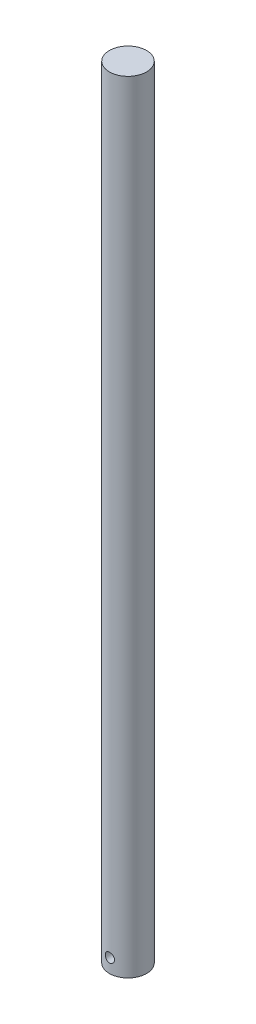
ISO-10303-21;
HEADER;
FILE_DESCRIPTION(('STEP AP214'),'2;1');
FILE_NAME('part.step','',(''),(''),'','','');
FILE_SCHEMA(('AUTOMOTIVE_DESIGN { 1 0 10303 214 1 1 1 1 }'));
ENDSEC;
DATA;
#1=APPLICATION_CONTEXT('core data for automotive mechanical design processes');
#2=APPLICATION_PROTOCOL_DEFINITION('international standard','automotive_design',2000,#1);
#3=PRODUCT_CONTEXT('',#1,'mechanical');
#4=PRODUCT('Part','Part','',(#3));
#5=PRODUCT_RELATED_PRODUCT_CATEGORY('part','',(#4));
#6=PRODUCT_DEFINITION_FORMATION('','',#4);
#7=PRODUCT_DEFINITION_CONTEXT('part definition',#1,'design');
#8=PRODUCT_DEFINITION('design','',#6,#7);
#9=PRODUCT_DEFINITION_SHAPE('','',#8);
#10=(LENGTH_UNIT() NAMED_UNIT(*) SI_UNIT(.MILLI.,.METRE.));
#11=(NAMED_UNIT(*) PLANE_ANGLE_UNIT() SI_UNIT($,.RADIAN.));
#12=(NAMED_UNIT(*) SI_UNIT($,.STERADIAN.) SOLID_ANGLE_UNIT());
#13=UNCERTAINTY_MEASURE_WITH_UNIT(LENGTH_MEASURE(1.E-05),#10,'distance_accuracy_value','');
#14=(GEOMETRIC_REPRESENTATION_CONTEXT(3) GLOBAL_UNCERTAINTY_ASSIGNED_CONTEXT((#13)) GLOBAL_UNIT_ASSIGNED_CONTEXT((#10,
#11,#12)) REPRESENTATION_CONTEXT('',''));
#15=CARTESIAN_POINT('',(0.,0.,0.));
#16=DIRECTION('',(0.,0.,1.));
#17=DIRECTION('',(1.,0.,0.));
#18=AXIS2_PLACEMENT_3D('',#15,#16,#17);
#19=CARTESIAN_POINT('',(0.,420.,0.));
#20=DIRECTION('',(0.,-1.,0.));
#21=DIRECTION('',(0.,0.,-1.));
#22=AXIS2_PLACEMENT_3D('',#19,#20,#21);
#23=CYLINDRICAL_SURFACE('',#22,10.);
#24=CARTESIAN_POINT('',(0.,9.95000000000001,-10.));
#25=CARTESIAN_POINT('',(-0.138126814449551,9.94999612376975,-9.99999766446687));
#26=CARTESIAN_POINT('',(-0.276296929717937,9.93851408204369,-9.99710963553044));
#27=CARTESIAN_POINT('',(-0.54867720628422,9.89295808115499,-9.98586856383157));
#28=CARTESIAN_POINT('',(-0.682885078117899,9.85887131743691,-9.97751242366627));
#29=CARTESIAN_POINT('',(-0.943368120304295,9.76926791089652,-9.9562604388672));
#30=CARTESIAN_POINT('',(-1.06965260571667,9.71377700214122,-9.94337004736764));
#31=CARTESIAN_POINT('',(-1.31112021984071,9.58303101659193,-9.91442239679369));
#32=CARTESIAN_POINT('',(-1.42630297391461,9.50777527313505,-9.89836503090261));
#33=CARTESIAN_POINT('',(-1.64466987883486,9.3379986839097,-9.86445689319489));
#34=CARTESIAN_POINT('',(-1.74759281676843,9.24314737506823,-9.84657845246877));
#35=CARTESIAN_POINT('',(-1.93624821200553,9.03757965848494,-9.8112270019656));
#36=CARTESIAN_POINT('',(-2.02197872824865,8.9268614617551,-9.79375403816446));
#37=CARTESIAN_POINT('',(-2.17504423799829,8.69067462210501,-9.76091292830281));
#38=CARTESIAN_POINT('',(-2.2420870265419,8.56501128198545,-9.74557990774685));
#39=CARTESIAN_POINT('',(-2.35399484758457,8.30375264723327,-9.71915824696694));
#40=CARTESIAN_POINT('',(-2.39886342573357,8.16815894444664,-9.70806892824031));
#41=CARTESIAN_POINT('',(-2.46425806134127,7.89376083633056,-9.69167461160538));
#42=CARTESIAN_POINT('',(-2.48525378055342,7.75507517327001,-9.68625818328352));
#43=CARTESIAN_POINT('',(-2.50376962511068,7.47605238500109,-9.68148937432652));
#44=CARTESIAN_POINT('',(-2.50129356969685,7.33571553217977,-9.68213600713214));
#45=CARTESIAN_POINT('',(-2.47331087439951,7.06097365375774,-9.68932009194695));
#46=CARTESIAN_POINT('',(-2.44836390031772,6.92650729755778,-9.69571438345489));
#47=CARTESIAN_POINT('',(-2.37704031150499,6.6637315818149,-9.71344516118448));
#48=CARTESIAN_POINT('',(-2.33066217011565,6.53542266161846,-9.72478199948731));
#49=CARTESIAN_POINT('',(-2.21731579656197,6.28710330624645,-9.75125189842765));
#50=CARTESIAN_POINT('',(-2.1501444453882,6.16718971368405,-9.76642212449693));
#51=CARTESIAN_POINT('',(-1.99726046002491,5.94013548373863,-9.79882851409985));
#52=CARTESIAN_POINT('',(-1.91154458134806,5.83299708655458,-9.81606503891047));
#53=CARTESIAN_POINT('',(-1.72110570780203,5.63132730717599,-9.85126467566486));
#54=CARTESIAN_POINT('',(-1.61591043027643,5.53724251656441,-9.86923449130002));
#55=CARTESIAN_POINT('',(-1.39101986250617,5.36796459589349,-9.90343275964594));
#56=CARTESIAN_POINT('',(-1.27132412951324,5.29277204289405,-9.91966115915679));
#57=CARTESIAN_POINT('',(-1.02019314780232,5.16324902295935,-9.94862886823651));
#58=CARTESIAN_POINT('',(-0.888718988681039,5.10899109957595,-9.96135600212879));
#59=CARTESIAN_POINT('',(-0.618126680238138,5.02347115715071,-9.98179861652361));
#60=CARTESIAN_POINT('',(-0.479009998584141,4.9922047393031,-9.98951505565468));
#61=CARTESIAN_POINT('',(-0.200899950650045,4.95423739073527,-9.99892498785624));
#62=CARTESIAN_POINT('',(-0.0619945333136842,4.94692828987449,-10.0007675584713));
#63=CARTESIAN_POINT('',(0.215054791335847,4.95541500342581,-9.99864674690754));
#64=CARTESIAN_POINT('',(0.353198766074327,4.97120873799856,-9.99468388736421));
#65=CARTESIAN_POINT('',(0.622690447960818,5.02495151398562,-9.98149301878918));
#66=CARTESIAN_POINT('',(0.754108531614584,5.06256877246162,-9.97234390309647));
#67=CARTESIAN_POINT('',(1.00876215408753,5.1585118067141,-9.94981177723595));
#68=CARTESIAN_POINT('',(1.13199686505442,5.21683967385537,-9.93642833949965));
#69=CARTESIAN_POINT('',(1.36920522404972,5.35372688145779,-9.9065551321037));
#70=CARTESIAN_POINT('',(1.48297573639294,5.43262685399427,-9.89001445610999));
#71=CARTESIAN_POINT('',(1.69587768940552,5.60798318132861,-9.85574181979586));
#72=CARTESIAN_POINT('',(1.79500659828875,5.70444256602941,-9.83800965421578));
#73=CARTESIAN_POINT('',(1.97831761345414,5.91500326807284,-9.80281594932498));
#74=CARTESIAN_POINT('',(2.06207311270184,6.02947950499926,-9.78537173637463));
#75=CARTESIAN_POINT('',(2.20918459835604,6.27122105744763,-9.75321463970069));
#76=CARTESIAN_POINT('',(2.27254149026901,6.39848580495074,-9.73850163474941));
#77=CARTESIAN_POINT('',(2.37658570101223,6.66150953734373,-9.71363491194665));
#78=CARTESIAN_POINT('',(2.41740732773931,6.79721271385383,-9.70345425375809));
#79=CARTESIAN_POINT('',(2.47557609990489,7.07384939642549,-9.68877906706586));
#80=CARTESIAN_POINT('',(2.49292837912652,7.21478175170241,-9.68428329504044));
#81=CARTESIAN_POINT('',(2.50339765056083,7.49353503976935,-9.68158168701612));
#82=CARTESIAN_POINT('',(2.49719649630131,7.63132905854408,-9.68319887888034));
#83=CARTESIAN_POINT('',(2.46229546385366,7.90383981444377,-9.69213181672143));
#84=CARTESIAN_POINT('',(2.43359603781098,8.03855661335532,-9.69944744817731));
#85=CARTESIAN_POINT('',(2.35488553240495,8.30034743177644,-9.71885434473222));
#86=CARTESIAN_POINT('',(2.30500234113404,8.42746217540055,-9.73091692061057));
#87=CARTESIAN_POINT('',(2.18544152267504,8.67160897118928,-9.7584625954084));
#88=CARTESIAN_POINT('',(2.11576115005696,8.78863962197814,-9.77394616867808));
#89=CARTESIAN_POINT('',(1.95644624772858,9.01259104833676,-9.80709390439337));
#90=CARTESIAN_POINT('',(1.86633860485376,9.11916845570661,-9.82480441386302));
#91=CARTESIAN_POINT('',(1.66964895198288,9.31591174132566,-9.86013378743769));
#92=CARTESIAN_POINT('',(1.56306303543524,9.40607371685494,-9.87775262878422));
#93=CARTESIAN_POINT('',(1.33411264450432,9.56901884760768,-9.9112942607945));
#94=CARTESIAN_POINT('',(1.21149737052731,9.64145768945263,-9.92718055609783));
#95=CARTESIAN_POINT('',(0.95544343251746,9.76457910490088,-9.95508208291861));
#96=CARTESIAN_POINT('',(0.822012605727899,9.81527726774756,-9.96710008666301));
#97=CARTESIAN_POINT('',(0.574017088739119,9.88595305054942,-9.98413432609236));
#98=CARTESIAN_POINT('',(0.460633618180113,9.90991873842238,-9.99004308421151));
#99=CARTESIAN_POINT('',(0.231510119227138,9.9419432393699,-9.9979767538658));
#100=CARTESIAN_POINT('',(0.115770268737693,9.95000324884218,-10.0000019575149));
#101=CARTESIAN_POINT('',(0.,9.95000000000001,-10.));
#102=B_SPLINE_CURVE_WITH_KNOTS('',3,(#24,#25,#26,#27,#28,#29,#30,#31,#32,#33,#34,#35,#36,#37,
#38,#39,#40,#41,#42,#43,#44,#45,#46,#47,#48,#49,#50,#51,#52,#53,#54,#55,#56,#57,#58,#59,#60,#61,
#62,#63,#64,#65,#66,#67,#68,#69,#70,#71,#72,#73,#74,#75,#76,#77,#78,#79,#80,#81,#82,#83,#84,#85,
#86,#87,#88,#89,#90,#91,#92,#93,#94,#95,#96,#97,#98,#99,#100,#101),.UNSPECIFIED.,.T.,.F.,(4,2,2,
2,2,2,2,2,2,2,2,2,2,2,2,2,2,2,2,2,2,2,2,2,2,2,2,2,2,2,2,2,2,2,2,2,2,2,4),(0.,0.413956187453149,
0.828147062939834,1.24184150381018,1.65554990028222,2.07690725728565,2.4983121596677,
2.92597745909679,3.35357435282281,3.77260491835117,4.19156730193363,4.60037495017231,
5.00921172448932,5.42217546462,5.83521151399139,6.26002501620567,6.6848514926928,
7.11113715020725,7.53734122819939,7.95263848254328,8.36789835193439,8.7770045752893,
9.18615212209352,9.60255979281121,10.0190393835223,10.4457418201299,10.8724253125471,
11.2965375769764,11.7205570543048,12.1323963400748,12.5442273493652,12.9536066760888,
13.3630428023797,13.7831596069298,14.2033761629383,14.6312030917578,15.0587227304538,
15.4057040491338,15.752659267482),.UNSPECIFIED.);
#103=CARTESIAN_POINT('',(0.,9.95000000000001,-10.));
#104=VERTEX_POINT('',#103);
#105=EDGE_CURVE('E35',#104,#104,#102,.T.);
#106=ORIENTED_EDGE('',*,*,#105,.T.);
#107=EDGE_LOOP('',(#106));
#108=FACE_BOUND('',#107,.T.);
#109=CARTESIAN_POINT('',(2.5,7.45,9.68245836551854));
#110=CARTESIAN_POINT('',(2.49999607859307,7.31194924907342,9.6824610008786));
#111=CARTESIAN_POINT('',(2.48852624549765,7.17385510132148,9.68544306014597));
#112=CARTESIAN_POINT('',(2.44302312546379,6.90163242182649,9.69701861992564));
#113=CARTESIAN_POINT('',(2.40897670674211,6.76750624553181,9.7056153862163));
#114=CARTESIAN_POINT('',(2.31949119963204,6.50719646181282,9.7273872459615));
#115=CARTESIAN_POINT('',(2.26407972785449,6.38100284461429,9.74055642690458));
#116=CARTESIAN_POINT('',(2.13352114126138,6.13968914746012,9.76998192028759));
#117=CARTESIAN_POINT('',(2.05837318856069,6.02456953791978,9.78623836378489));
#118=CARTESIAN_POINT('',(1.88870842731188,5.80613835473778,9.82040716355625));
#119=CARTESIAN_POINT('',(1.79383688770405,5.70310639964995,9.83834597623034));
#120=CARTESIAN_POINT('',(1.58818206410066,5.51423860563966,9.87362875515294));
#121=CARTESIAN_POINT('',(1.47739729418031,5.42840437437825,9.89097266566388));
#122=CARTESIAN_POINT('',(1.24114520107895,5.27522453236872,9.92340415520582));
#123=CARTESIAN_POINT('',(1.11549457619512,5.20815361183853,9.93845687400592));
#124=CARTESIAN_POINT('',(0.854263184292762,5.09619035584691,9.96430811925984));
#125=CARTESIAN_POINT('',(0.71868388579194,5.05129474808448,9.97510727334345));
#126=CARTESIAN_POINT('',(0.444358758754161,4.98585216542141,9.9910475884818));
#127=CARTESIAN_POINT('',(0.305732719548975,4.96483035567342,9.99629893844314));
#128=CARTESIAN_POINT('',(0.0268288192627691,4.94624162072445,10.000935941073));
#129=CARTESIAN_POINT('',(-0.113448794538069,4.9486712277904,10.000322460967));
#130=CARTESIAN_POINT('',(-0.388380617930968,4.97657485025014,9.99338094953534));
#131=CARTESIAN_POINT('',(-0.523090539002667,5.00153632505385,9.98718002340871));
#132=CARTESIAN_POINT('',(-0.786345618534215,5.0729712700485,9.96990836524857));
#133=CARTESIAN_POINT('',(-0.914890448426095,5.11944588537741,9.95883737398452));
#134=CARTESIAN_POINT('',(-1.16351675875452,5.23300257068706,9.93287509700884));
#135=CARTESIAN_POINT('',(-1.28351127441626,5.30026704466174,9.91795019695011));
#136=CARTESIAN_POINT('',(-1.51068905585122,5.45335567911626,9.88589903809692));
#137=CARTESIAN_POINT('',(-1.61787008771377,5.53918306856062,9.8687723965265));
#138=CARTESIAN_POINT('',(-1.81943508771239,5.72970874198237,9.83363713769356));
#139=CARTESIAN_POINT('',(-1.91339419768799,5.83485489234774,9.81561719525297));
#140=CARTESIAN_POINT('',(-2.08244093990755,6.05959997354028,9.78115043517327));
#141=CARTESIAN_POINT('',(-2.15752769011507,6.1791995794911,9.76470369108289));
#142=CARTESIAN_POINT('',(-2.28697032255647,6.43029003414886,9.73520496829319));
#143=CARTESIAN_POINT('',(-2.34122391742613,6.5618357303128,9.72216983717007));
#144=CARTESIAN_POINT('',(-2.42671405159095,6.83258546807684,9.70118640148669));
#145=CARTESIAN_POINT('',(-2.45795551638266,6.97178786398459,9.69323700842733));
#146=CARTESIAN_POINT('',(-2.49582963866592,7.24995950152992,9.68355356007457));
#147=CARTESIAN_POINT('',(-2.50309047391912,7.38883779334102,9.68166088976933));
#148=CARTESIAN_POINT('',(-2.49451699051516,7.66582193658525,9.68387343364692));
#149=CARTESIAN_POINT('',(-2.4786847978498,7.80392785794944,9.687978095703));
#150=CARTESIAN_POINT('',(-2.42492546393825,8.07311426494857,9.7015708198498));
#151=CARTESIAN_POINT('',(-2.3873640682819,8.2042727265692,9.71096970242532));
#152=CARTESIAN_POINT('',(-2.29161808167046,8.45843145785333,9.73400718262805));
#153=CARTESIAN_POINT('',(-2.2334310477125,8.58143075905578,9.74764628246408));
#154=CARTESIAN_POINT('',(-2.0967706679366,8.8184412778669,9.77796137095511));
#155=CARTESIAN_POINT('',(-2.01792175383564,8.93222884004298,9.79469168607245));
#156=CARTESIAN_POINT('',(-1.84265073233613,9.14518836280147,9.82917083071113));
#157=CARTESIAN_POINT('',(-1.7462257370136,9.2443579166501,9.84691982728307));
#158=CARTESIAN_POINT('',(-1.53565680246182,9.42781104257092,9.88197403031774));
#159=CARTESIAN_POINT('',(-1.42112988132898,9.5116600625488,9.8992570206188));
#160=CARTESIAN_POINT('',(-1.17925670673669,9.65893586695125,9.93097216613689));
#161=CARTESIAN_POINT('',(-1.05191112239398,9.72236371660821,9.94540447003949));
#162=CARTESIAN_POINT('',(-0.788895504327727,9.82644603452793,9.96970115738325));
#163=CARTESIAN_POINT('',(-0.653293452569706,9.86726428437906,9.97959830022409));
#164=CARTESIAN_POINT('',(-0.376874400797018,9.92546033460841,9.99385293395789));
#165=CARTESIAN_POINT('',(-0.236058412603102,9.94284265873904,9.99821149393422));
#166=CARTESIAN_POINT('',(0.0427088161083062,9.95341897393885,10.0008542352202));
#167=CARTESIAN_POINT('',(0.180634567415052,9.94725427273852,9.99929947199971));
#168=CARTESIAN_POINT('',(0.453418741036875,9.91238043176413,9.99064741143608));
#169=CARTESIAN_POINT('',(0.58827725445232,9.88367196246708,9.98355027892922));
#170=CARTESIAN_POINT('',(0.850427589111934,9.80486945057284,9.96463582134723));
#171=CARTESIAN_POINT('',(0.977756236452157,9.75489136671405,9.95284411255981));
#172=CARTESIAN_POINT('',(1.22229263260406,9.63507355245107,9.92578222284145));
#173=CARTESIAN_POINT('',(1.33949910316408,9.56523131832379,9.91051160346894));
#174=CARTESIAN_POINT('',(1.56350482105826,9.40571191500967,9.87768124200718));
#175=CARTESIAN_POINT('',(1.66998747074584,9.31559964274043,9.86007542354161));
#176=CARTESIAN_POINT('',(1.86653755068376,9.11894287005663,9.82476622642974));
#177=CARTESIAN_POINT('',(1.95660081269147,9.01239420972209,9.80706282418256));
#178=CARTESIAN_POINT('',(2.11940506617958,8.78349646452635,9.77318689613756));
#179=CARTESIAN_POINT('',(2.19179154854095,8.66088969158687,9.75704909183222));
#180=CARTESIAN_POINT('',(2.31481724146367,8.40486127531295,9.7285988873707));
#181=CARTESIAN_POINT('',(2.36547227438038,8.27144758476538,9.71628370583034));
#182=CARTESIAN_POINT('',(2.43605632142751,8.0235574704121,9.69879771876843));
#183=CARTESIAN_POINT('',(2.4599829264922,7.91026708903466,9.69271657508747));
#184=CARTESIAN_POINT('',(2.49195573142942,7.68132782750578,9.6845459645655));
#185=CARTESIAN_POINT('',(2.50000328592938,7.56567914938899,9.68245615722769));
#186=CARTESIAN_POINT('',(2.5,7.45,9.68245836551854));
#187=B_SPLINE_CURVE_WITH_KNOTS('',3,(#109,#110,#111,#112,#113,#114,#115,#116,#117,#118,#119,
#120,#121,#122,#123,#124,#125,#126,#127,#128,#129,#130,#131,#132,#133,#134,#135,#136,#137,#138,
#139,#140,#141,#142,#143,#144,#145,#146,#147,#148,#149,#150,#151,#152,#153,#154,#155,#156,#157,
#158,#159,#160,#161,#162,#163,#164,#165,#166,#167,#168,#169,#170,#171,#172,#173,#174,#175,#176,
#177,#178,#179,#180,#181,#182,#183,#184,#185,#186),.UNSPECIFIED.,.T.,.F.,(4,2,2,2,2,2,2,2,2,2,2,
2,2,2,2,2,2,2,2,2,2,2,2,2,2,2,2,2,2,2,2,2,2,2,2,2,2,2,4),(0.,0.413727441736137,
0.827695741428666,1.24113072716602,1.65458326755479,2.07623954192976,2.49793521479867,
2.9255149639792,3.35303159847092,3.77188750995347,4.19068148666021,4.60018262688947,
5.00970556724786,5.42292874254445,5.83622385468913,6.26070466571912,6.68520531199802,
7.11176432008403,7.53823200129547,7.95343574764204,8.36860127188747,8.77697405014152,
9.18539521426363,9.60182845864102,10.0183301888999,10.4452533097026,10.872154157245,
11.2959207281187,11.7196054891398,12.131834461324,12.5440511738193,12.9540487656466,
13.3640980574302,13.7839709658702,14.2039503157045,14.6317647729113,15.0592672137501,
15.4059782718572,15.7526597510792),.UNSPECIFIED.);
#188=CARTESIAN_POINT('',(2.5,7.45,9.68245836551854));
#189=VERTEX_POINT('',#188);
#190=EDGE_CURVE('E48',#189,#189,#187,.T.);
#191=ORIENTED_EDGE('',*,*,#190,.T.);
#192=EDGE_LOOP('',(#191));
#193=FACE_BOUND('',#192,.T.);
#194=CARTESIAN_POINT('',(0.,420.,0.));
#195=DIRECTION('',(0.,1.,0.));
#196=DIRECTION('',(0.,0.,1.));
#197=AXIS2_PLACEMENT_3D('',#194,#195,#196);
#198=CIRCLE('',#197,10.);
#199=CARTESIAN_POINT('',(0.,420.,10.));
#200=VERTEX_POINT('',#199);
#201=EDGE_CURVE('E10',#200,#200,#198,.T.);
#202=ORIENTED_EDGE('',*,*,#201,.F.);
#203=EDGE_LOOP('',(#202));
#204=FACE_BOUND('',#203,.T.);
#205=CARTESIAN_POINT('',(0.,0.,0.));
#206=DIRECTION('',(0.,1.,0.));
#207=DIRECTION('',(0.,0.,1.));
#208=AXIS2_PLACEMENT_3D('',#205,#206,#207);
#209=CIRCLE('',#208,10.);
#210=CARTESIAN_POINT('',(0.,0.,10.));
#211=VERTEX_POINT('',#210);
#212=EDGE_CURVE('E42',#211,#211,#209,.T.);
#213=ORIENTED_EDGE('',*,*,#212,.T.);
#214=EDGE_LOOP('',(#213));
#215=FACE_BOUND('',#214,.T.);
#216=ADVANCED_FACE('F31',(#108,#193,#204,#215),#23,.T.);
#217=CARTESIAN_POINT('',(0.,420.,0.));
#218=DIRECTION('',(0.,1.,0.));
#219=DIRECTION('',(0.,0.,1.));
#220=AXIS2_PLACEMENT_3D('',#217,#218,#219);
#221=PLANE('',#220);
#222=ORIENTED_EDGE('',*,*,#201,.T.);
#223=EDGE_LOOP('',(#222));
#224=FACE_BOUND('',#223,.T.);
#225=ADVANCED_FACE('F58',(#224),#221,.T.);
#226=CARTESIAN_POINT('',(0.,0.,0.));
#227=DIRECTION('',(0.,1.,0.));
#228=DIRECTION('',(0.,0.,1.));
#229=AXIS2_PLACEMENT_3D('',#226,#227,#228);
#230=PLANE('',#229);
#231=ORIENTED_EDGE('',*,*,#212,.F.);
#232=EDGE_LOOP('',(#231));
#233=FACE_BOUND('',#232,.T.);
#234=ADVANCED_FACE('F56',(#233),#230,.F.);
#235=CARTESIAN_POINT('',(0.,7.45,-50.));
#236=DIRECTION('',(0.,0.,1.));
#237=DIRECTION('',(1.,0.,0.));
#238=AXIS2_PLACEMENT_3D('',#235,#236,#237);
#239=CYLINDRICAL_SURFACE('',#238,2.5);
#240=ORIENTED_EDGE('',*,*,#190,.F.);
#241=EDGE_LOOP('',(#240));
#242=FACE_BOUND('',#241,.T.);
#243=ORIENTED_EDGE('',*,*,#105,.F.);
#244=EDGE_LOOP('',(#243));
#245=FACE_BOUND('',#244,.T.);
#246=ADVANCED_FACE('F52',(#242,#245),#239,.F.);
#247=CLOSED_SHELL('',(#216,#225,#234,#246));
#248=MANIFOLD_SOLID_BREP('B2',#247);
#249=ADVANCED_BREP_SHAPE_REPRESENTATION('',(#18,#248),#14);
#250=SHAPE_DEFINITION_REPRESENTATION(#9,#249);
ENDSEC;
END-ISO-10303-21;
